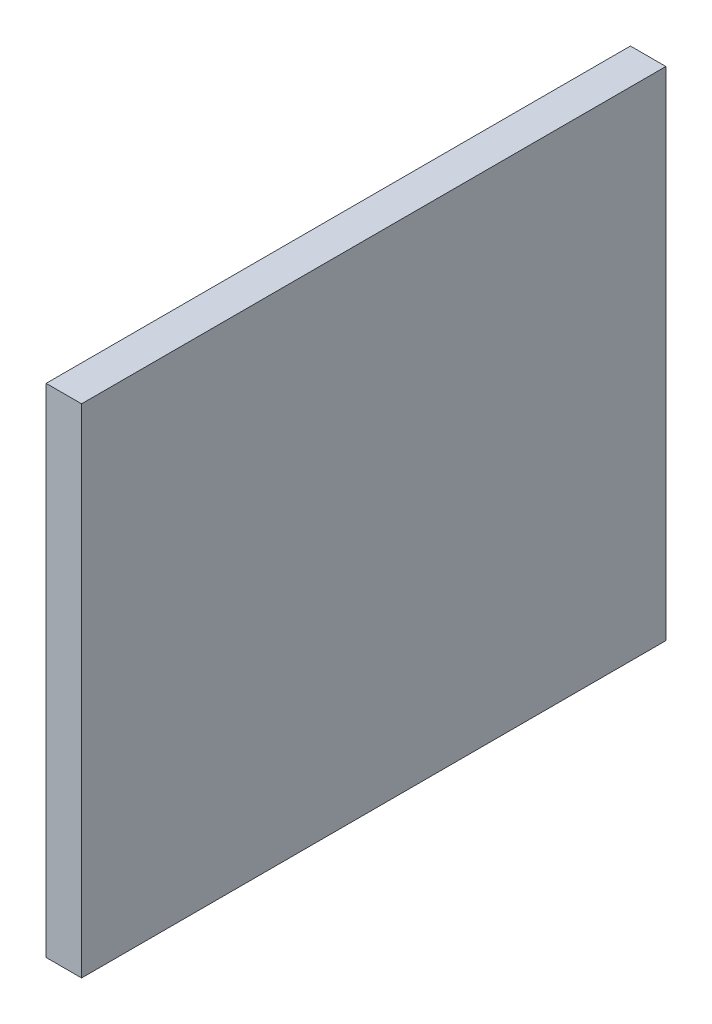
ISO-10303-21;
HEADER;
FILE_DESCRIPTION(('STEP AP214'),'2;1');
FILE_NAME('part.step','',(''),(''),'','','');
FILE_SCHEMA(('AUTOMOTIVE_DESIGN { 1 0 10303 214 1 1 1 1 }'));
ENDSEC;
DATA;
#1=APPLICATION_CONTEXT('core data for automotive mechanical design processes');
#2=APPLICATION_PROTOCOL_DEFINITION('international standard','automotive_design',2000,#1);
#3=PRODUCT_CONTEXT('',#1,'mechanical');
#4=PRODUCT('Part','Part','',(#3));
#5=PRODUCT_RELATED_PRODUCT_CATEGORY('part','',(#4));
#6=PRODUCT_DEFINITION_FORMATION('','',#4);
#7=PRODUCT_DEFINITION_CONTEXT('part definition',#1,'design');
#8=PRODUCT_DEFINITION('design','',#6,#7);
#9=PRODUCT_DEFINITION_SHAPE('','',#8);
#10=(LENGTH_UNIT() NAMED_UNIT(*) SI_UNIT(.MILLI.,.METRE.));
#11=(NAMED_UNIT(*) PLANE_ANGLE_UNIT() SI_UNIT($,.RADIAN.));
#12=(NAMED_UNIT(*) SI_UNIT($,.STERADIAN.) SOLID_ANGLE_UNIT());
#13=UNCERTAINTY_MEASURE_WITH_UNIT(LENGTH_MEASURE(1.E-05),#10,'distance_accuracy_value','');
#14=(GEOMETRIC_REPRESENTATION_CONTEXT(3) GLOBAL_UNCERTAINTY_ASSIGNED_CONTEXT((#13)) GLOBAL_UNIT_ASSIGNED_CONTEXT((#10,
#11,#12)) REPRESENTATION_CONTEXT('',''));
#15=CARTESIAN_POINT('',(0.,0.,0.));
#16=DIRECTION('',(0.,0.,1.));
#17=DIRECTION('',(1.,0.,0.));
#18=AXIS2_PLACEMENT_3D('',#15,#16,#17);
#19=CARTESIAN_POINT('',(0.18200116,-2.55314958,6.0000007));
#20=DIRECTION('',(0.,0.,-1.));
#21=DIRECTION('',(0.,-1.,0.));
#22=AXIS2_PLACEMENT_3D('',#19,#20,#21);
#23=PLANE('',#22);
#24=DIRECTION('',(0.,1.,0.));
#25=VECTOR('',#24,1.);
#26=CARTESIAN_POINT('',(0.18200116,-2.55314958,6.0000007));
#27=LINE('',#26,#25);
#28=CARTESIAN_POINT('',(0.18200116,-2.55314958,6.0000007));
#29=VERTEX_POINT('',#28);
#30=CARTESIAN_POINT('',(0.18200116,2.55315212,6.0000007));
#31=VERTEX_POINT('',#30);
#32=EDGE_CURVE('E70',#29,#31,#27,.T.);
#33=ORIENTED_EDGE('',*,*,#32,.T.);
#34=DIRECTION('',(-1.,0.,0.));
#35=VECTOR('',#34,1.);
#36=CARTESIAN_POINT('',(0.18200116,2.55315212,6.0000007));
#37=LINE('',#36,#35);
#38=CARTESIAN_POINT('',(-0.18199862,2.55315212,6.0000007));
#39=VERTEX_POINT('',#38);
#40=EDGE_CURVE('E106',#31,#39,#37,.T.);
#41=ORIENTED_EDGE('',*,*,#40,.T.);
#42=DIRECTION('',(0.,-1.,0.));
#43=VECTOR('',#42,1.);
#44=CARTESIAN_POINT('',(-0.18199862,2.55315212,6.0000007));
#45=LINE('',#44,#43);
#46=CARTESIAN_POINT('',(-0.18199862,-2.55314958,6.0000007));
#47=VERTEX_POINT('',#46);
#48=EDGE_CURVE('E72',#39,#47,#45,.T.);
#49=ORIENTED_EDGE('',*,*,#48,.T.);
#50=DIRECTION('',(1.,0.,0.));
#51=VECTOR('',#50,1.);
#52=CARTESIAN_POINT('',(-0.18199862,-2.55314958,6.0000007));
#53=LINE('',#52,#51);
#54=EDGE_CURVE('E11',#47,#29,#53,.T.);
#55=ORIENTED_EDGE('',*,*,#54,.T.);
#56=EDGE_LOOP('',(#33,#41,#49,#55));
#57=FACE_BOUND('',#56,.T.);
#58=ADVANCED_FACE('F16',(#57),#23,.F.);
#59=CARTESIAN_POINT('',(0.18200116,-2.55314958,0.));
#60=DIRECTION('',(0.,0.,-1.));
#61=DIRECTION('',(0.,-1.,0.));
#62=AXIS2_PLACEMENT_3D('',#59,#60,#61);
#63=PLANE('',#62);
#64=DIRECTION('',(1.,0.,0.));
#65=VECTOR('',#64,1.);
#66=CARTESIAN_POINT('',(-0.18199862,-2.55314958,0.));
#67=LINE('',#66,#65);
#68=CARTESIAN_POINT('',(-0.18199862,-2.55314958,0.));
#69=VERTEX_POINT('',#68);
#70=CARTESIAN_POINT('',(0.18200116,-2.55314958,0.));
#71=VERTEX_POINT('',#70);
#72=EDGE_CURVE('E25',#69,#71,#67,.T.);
#73=ORIENTED_EDGE('',*,*,#72,.F.);
#74=DIRECTION('',(0.,-1.,0.));
#75=VECTOR('',#74,1.);
#76=CARTESIAN_POINT('',(-0.18199862,2.55315212,0.));
#77=LINE('',#76,#75);
#78=CARTESIAN_POINT('',(-0.18199862,2.55315212,0.));
#79=VERTEX_POINT('',#78);
#80=EDGE_CURVE('E93',#79,#69,#77,.T.);
#81=ORIENTED_EDGE('',*,*,#80,.F.);
#82=DIRECTION('',(-1.,0.,0.));
#83=VECTOR('',#82,1.);
#84=CARTESIAN_POINT('',(0.18200116,2.55315212,0.));
#85=LINE('',#84,#83);
#86=CARTESIAN_POINT('',(0.18200116,2.55315212,0.));
#87=VERTEX_POINT('',#86);
#88=EDGE_CURVE('E80',#87,#79,#85,.T.);
#89=ORIENTED_EDGE('',*,*,#88,.F.);
#90=DIRECTION('',(0.,1.,0.));
#91=VECTOR('',#90,1.);
#92=CARTESIAN_POINT('',(0.18200116,-2.55314958,0.));
#93=LINE('',#92,#91);
#94=EDGE_CURVE('E89',#71,#87,#93,.T.);
#95=ORIENTED_EDGE('',*,*,#94,.F.);
#96=EDGE_LOOP('',(#73,#81,#89,#95));
#97=FACE_BOUND('',#96,.T.);
#98=ADVANCED_FACE('F114',(#97),#63,.T.);
#99=CARTESIAN_POINT('',(-0.18199862,-2.55314958,0.));
#100=DIRECTION('',(0.,1.,0.));
#101=DIRECTION('',(1.,0.,0.));
#102=AXIS2_PLACEMENT_3D('',#99,#100,#101);
#103=PLANE('',#102);
#104=ORIENTED_EDGE('',*,*,#72,.T.);
#105=DIRECTION('',(0.,0.,1.));
#106=VECTOR('',#105,1.);
#107=CARTESIAN_POINT('',(0.18200116,-2.55314958,0.));
#108=LINE('',#107,#106);
#109=EDGE_CURVE('E75',#71,#29,#108,.T.);
#110=ORIENTED_EDGE('',*,*,#109,.T.);
#111=ORIENTED_EDGE('',*,*,#54,.F.);
#112=DIRECTION('',(0.,0.,1.));
#113=VECTOR('',#112,1.);
#114=CARTESIAN_POINT('',(-0.18199862,-2.55314958,0.));
#115=LINE('',#114,#113);
#116=EDGE_CURVE('E94',#69,#47,#115,.T.);
#117=ORIENTED_EDGE('',*,*,#116,.F.);
#118=EDGE_LOOP('',(#104,#110,#111,#117));
#119=FACE_BOUND('',#118,.T.);
#120=ADVANCED_FACE('F76',(#119),#103,.F.);
#121=CARTESIAN_POINT('',(-0.18199862,2.55315212,0.));
#122=DIRECTION('',(1.,0.,0.));
#123=DIRECTION('',(0.,1.,0.));
#124=AXIS2_PLACEMENT_3D('',#121,#122,#123);
#125=PLANE('',#124);
#126=ORIENTED_EDGE('',*,*,#80,.T.);
#127=ORIENTED_EDGE('',*,*,#116,.T.);
#128=ORIENTED_EDGE('',*,*,#48,.F.);
#129=DIRECTION('',(0.,0.,1.));
#130=VECTOR('',#129,1.);
#131=CARTESIAN_POINT('',(-0.18199862,2.55315212,0.));
#132=LINE('',#131,#130);
#133=EDGE_CURVE('E100',#79,#39,#132,.T.);
#134=ORIENTED_EDGE('',*,*,#133,.F.);
#135=EDGE_LOOP('',(#126,#127,#128,#134));
#136=FACE_BOUND('',#135,.T.);
#137=ADVANCED_FACE('F120',(#136),#125,.F.);
#138=CARTESIAN_POINT('',(0.18200116,2.55315212,0.));
#139=DIRECTION('',(0.,-1.,0.));
#140=DIRECTION('',(0.,0.,-1.));
#141=AXIS2_PLACEMENT_3D('',#138,#139,#140);
#142=PLANE('',#141);
#143=ORIENTED_EDGE('',*,*,#88,.T.);
#144=ORIENTED_EDGE('',*,*,#133,.T.);
#145=ORIENTED_EDGE('',*,*,#40,.F.);
#146=DIRECTION('',(0.,0.,1.));
#147=VECTOR('',#146,1.);
#148=CARTESIAN_POINT('',(0.18200116,2.55315212,0.));
#149=LINE('',#148,#147);
#150=EDGE_CURVE('E82',#87,#31,#149,.T.);
#151=ORIENTED_EDGE('',*,*,#150,.F.);
#152=EDGE_LOOP('',(#143,#144,#145,#151));
#153=FACE_BOUND('',#152,.T.);
#154=ADVANCED_FACE('F118',(#153),#142,.F.);
#155=CARTESIAN_POINT('',(0.18200116,-2.55314958,0.));
#156=DIRECTION('',(-1.,0.,0.));
#157=DIRECTION('',(0.,0.,1.));
#158=AXIS2_PLACEMENT_3D('',#155,#156,#157);
#159=PLANE('',#158);
#160=ORIENTED_EDGE('',*,*,#94,.T.);
#161=ORIENTED_EDGE('',*,*,#150,.T.);
#162=ORIENTED_EDGE('',*,*,#32,.F.);
#163=ORIENTED_EDGE('',*,*,#109,.F.);
#164=EDGE_LOOP('',(#160,#161,#162,#163));
#165=FACE_BOUND('',#164,.T.);
#166=ADVANCED_FACE('F18',(#165),#159,.F.);
#167=CLOSED_SHELL('',(#58,#98,#120,#137,#154,#166));
#168=MANIFOLD_SOLID_BREP('B1',#167);
#169=ADVANCED_BREP_SHAPE_REPRESENTATION('',(#18,#168),#14);
#170=SHAPE_DEFINITION_REPRESENTATION(#9,#169);
ENDSEC;
END-ISO-10303-21;
